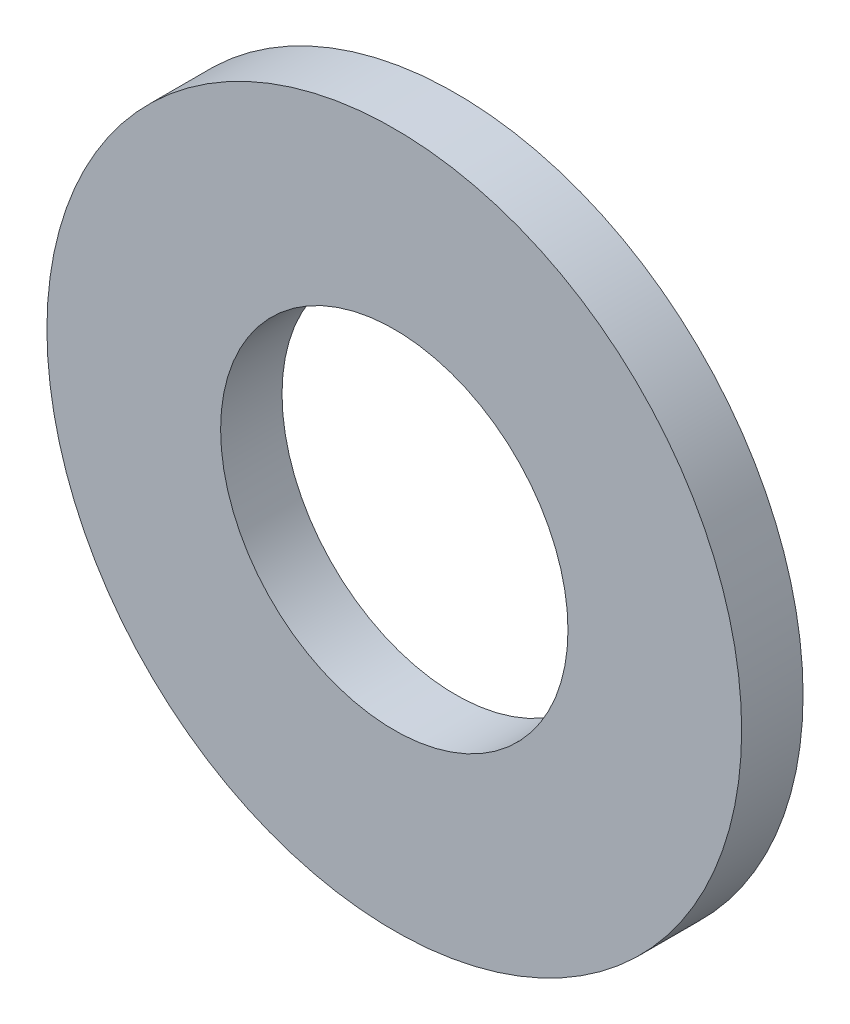
ISO-10303-21;
HEADER;
FILE_DESCRIPTION(('STEP AP214'),'2;1');
FILE_NAME('part.step','',(''),(''),'','','');
FILE_SCHEMA(('AUTOMOTIVE_DESIGN { 1 0 10303 214 1 1 1 1 }'));
ENDSEC;
DATA;
#1=APPLICATION_CONTEXT('core data for automotive mechanical design processes');
#2=APPLICATION_PROTOCOL_DEFINITION('international standard','automotive_design',2000,#1);
#3=PRODUCT_CONTEXT('',#1,'mechanical');
#4=PRODUCT('Part','Part','',(#3));
#5=PRODUCT_RELATED_PRODUCT_CATEGORY('part','',(#4));
#6=PRODUCT_DEFINITION_FORMATION('','',#4);
#7=PRODUCT_DEFINITION_CONTEXT('part definition',#1,'design');
#8=PRODUCT_DEFINITION('design','',#6,#7);
#9=PRODUCT_DEFINITION_SHAPE('','',#8);
#10=(LENGTH_UNIT() NAMED_UNIT(*) SI_UNIT(.MILLI.,.METRE.));
#11=(NAMED_UNIT(*) PLANE_ANGLE_UNIT() SI_UNIT($,.RADIAN.));
#12=(NAMED_UNIT(*) SI_UNIT($,.STERADIAN.) SOLID_ANGLE_UNIT());
#13=UNCERTAINTY_MEASURE_WITH_UNIT(LENGTH_MEASURE(1.E-05),#10,'distance_accuracy_value','');
#14=(GEOMETRIC_REPRESENTATION_CONTEXT(3) GLOBAL_UNCERTAINTY_ASSIGNED_CONTEXT((#13)) GLOBAL_UNIT_ASSIGNED_CONTEXT((#10,
#11,#12)) REPRESENTATION_CONTEXT('',''));
#15=CARTESIAN_POINT('',(0.,0.,0.));
#16=DIRECTION('',(0.,0.,1.));
#17=DIRECTION('',(1.,0.,0.));
#18=AXIS2_PLACEMENT_3D('',#15,#16,#17);
#19=CARTESIAN_POINT('',(0.,0.,0.));
#20=DIRECTION('',(0.,0.,1.));
#21=DIRECTION('',(1.,0.,0.));
#22=AXIS2_PLACEMENT_3D('',#19,#20,#21);
#23=PLANE('',#22);
#24=CARTESIAN_POINT('',(0.,0.,0.));
#25=DIRECTION('',(0.,0.,-1.));
#26=DIRECTION('',(-1.,0.,0.));
#27=AXIS2_PLACEMENT_3D('',#24,#25,#26);
#28=CIRCLE('',#27,8.76300000000003);
#29=CARTESIAN_POINT('',(-8.76300000000003,0.,0.));
#30=VERTEX_POINT('',#29);
#31=EDGE_CURVE('E27',#30,#30,#28,.F.);
#32=ORIENTED_EDGE('',*,*,#31,.F.);
#33=EDGE_LOOP('',(#32));
#34=FACE_BOUND('',#33,.T.);
#35=CARTESIAN_POINT('',(0.,0.,0.));
#36=DIRECTION('',(0.,0.,-1.));
#37=DIRECTION('',(-1.,0.,0.));
#38=AXIS2_PLACEMENT_3D('',#35,#36,#37);
#39=CIRCLE('',#38,4.38150000000001);
#40=CARTESIAN_POINT('',(-4.38150000000001,0.,0.));
#41=VERTEX_POINT('',#40);
#42=EDGE_CURVE('E18',#41,#41,#39,.F.);
#43=ORIENTED_EDGE('',*,*,#42,.T.);
#44=EDGE_LOOP('',(#43));
#45=FACE_BOUND('',#44,.T.);
#46=ADVANCED_FACE('F15',(#34,#45),#23,.F.);
#47=CARTESIAN_POINT('',(0.,0.,1.5494));
#48=DIRECTION('',(0.,0.,-1.));
#49=DIRECTION('',(-1.,0.,0.));
#50=AXIS2_PLACEMENT_3D('',#47,#48,#49);
#51=CYLINDRICAL_SURFACE('',#50,4.38150000000001);
#52=ORIENTED_EDGE('',*,*,#42,.F.);
#53=EDGE_LOOP('',(#52));
#54=FACE_BOUND('',#53,.T.);
#55=CARTESIAN_POINT('',(0.,0.,1.5494));
#56=DIRECTION('',(0.,0.,-1.));
#57=DIRECTION('',(-1.,0.,0.));
#58=AXIS2_PLACEMENT_3D('',#55,#56,#57);
#59=CIRCLE('',#58,4.38150000000001);
#60=CARTESIAN_POINT('',(-4.38150000000001,0.,1.5494));
#61=VERTEX_POINT('',#60);
#62=EDGE_CURVE('E22',#61,#61,#59,.T.);
#63=ORIENTED_EDGE('',*,*,#62,.F.);
#64=EDGE_LOOP('',(#63));
#65=FACE_BOUND('',#64,.T.);
#66=ADVANCED_FACE('F36',(#54,#65),#51,.F.);
#67=CARTESIAN_POINT('',(0.,0.,1.5494));
#68=DIRECTION('',(0.,0.,-1.));
#69=DIRECTION('',(-1.,0.,0.));
#70=AXIS2_PLACEMENT_3D('',#67,#68,#69);
#71=CYLINDRICAL_SURFACE('',#70,8.76300000000003);
#72=ORIENTED_EDGE('',*,*,#31,.T.);
#73=EDGE_LOOP('',(#72));
#74=FACE_BOUND('',#73,.T.);
#75=CARTESIAN_POINT('',(0.,0.,1.5494));
#76=DIRECTION('',(0.,0.,-1.));
#77=DIRECTION('',(-1.,0.,0.));
#78=AXIS2_PLACEMENT_3D('',#75,#76,#77);
#79=CIRCLE('',#78,8.76300000000003);
#80=CARTESIAN_POINT('',(-8.76300000000003,0.,1.5494));
#81=VERTEX_POINT('',#80);
#82=EDGE_CURVE('E10',#81,#81,#79,.F.);
#83=ORIENTED_EDGE('',*,*,#82,.F.);
#84=EDGE_LOOP('',(#83));
#85=FACE_BOUND('',#84,.T.);
#86=ADVANCED_FACE('F39',(#74,#85),#71,.T.);
#87=CARTESIAN_POINT('',(0.,0.,1.5494));
#88=DIRECTION('',(0.,0.,1.));
#89=DIRECTION('',(1.,0.,0.));
#90=AXIS2_PLACEMENT_3D('',#87,#88,#89);
#91=PLANE('',#90);
#92=ORIENTED_EDGE('',*,*,#82,.T.);
#93=EDGE_LOOP('',(#92));
#94=FACE_BOUND('',#93,.T.);
#95=ORIENTED_EDGE('',*,*,#62,.T.);
#96=EDGE_LOOP('',(#95));
#97=FACE_BOUND('',#96,.T.);
#98=ADVANCED_FACE('F42',(#94,#97),#91,.T.);
#99=CLOSED_SHELL('',(#46,#66,#86,#98));
#100=MANIFOLD_SOLID_BREP('B1',#99);
#101=ADVANCED_BREP_SHAPE_REPRESENTATION('',(#18,#100),#14);
#102=SHAPE_DEFINITION_REPRESENTATION(#9,#101);
ENDSEC;
END-ISO-10303-21;
